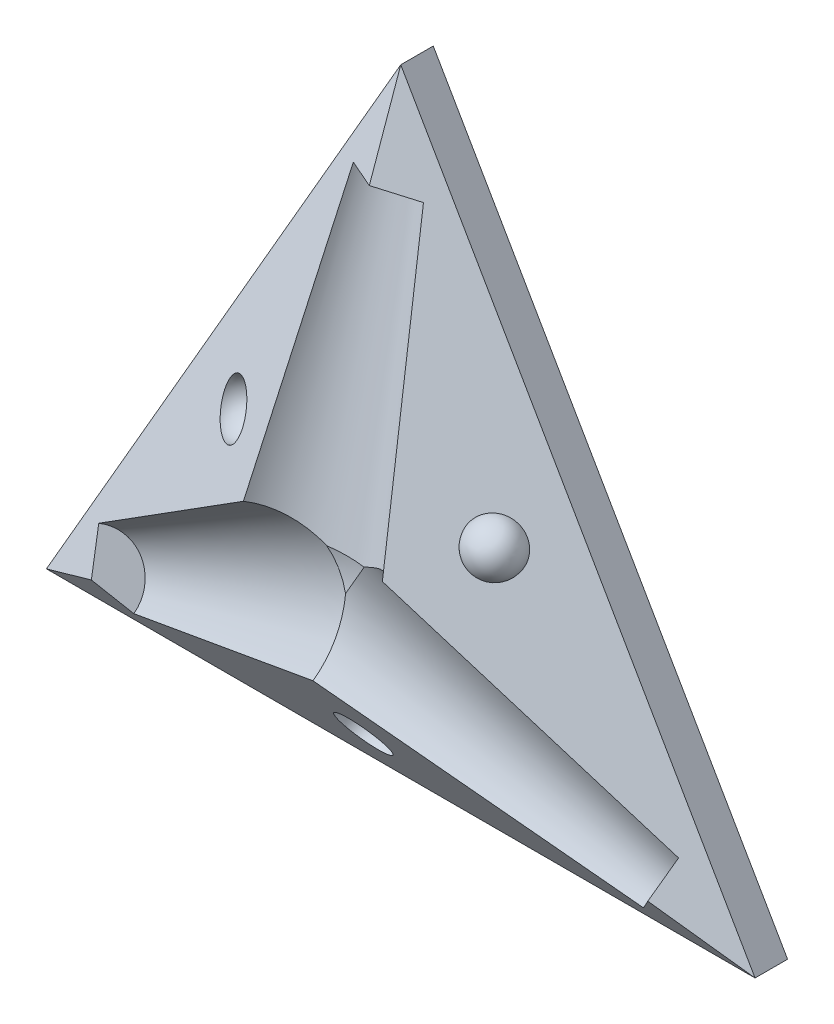
ISO-10303-21;
HEADER;
FILE_DESCRIPTION(('STEP AP214'),'2;1');
FILE_NAME('part.step','',(''),(''),'','','');
FILE_SCHEMA(('AUTOMOTIVE_DESIGN { 1 0 10303 214 1 1 1 1 }'));
ENDSEC;
DATA;
#1=APPLICATION_CONTEXT('core data for automotive mechanical design processes');
#2=APPLICATION_PROTOCOL_DEFINITION('international standard','automotive_design',2000,#1);
#3=PRODUCT_CONTEXT('',#1,'mechanical');
#4=PRODUCT('Part','Part','',(#3));
#5=PRODUCT_RELATED_PRODUCT_CATEGORY('part','',(#4));
#6=PRODUCT_DEFINITION_FORMATION('','',#4);
#7=PRODUCT_DEFINITION_CONTEXT('part definition',#1,'design');
#8=PRODUCT_DEFINITION('design','',#6,#7);
#9=PRODUCT_DEFINITION_SHAPE('','',#8);
#10=(LENGTH_UNIT() NAMED_UNIT(*) SI_UNIT(.MILLI.,.METRE.));
#11=(NAMED_UNIT(*) PLANE_ANGLE_UNIT() SI_UNIT($,.RADIAN.));
#12=(NAMED_UNIT(*) SI_UNIT($,.STERADIAN.) SOLID_ANGLE_UNIT());
#13=UNCERTAINTY_MEASURE_WITH_UNIT(LENGTH_MEASURE(1.E-05),#10,'distance_accuracy_value','');
#14=(GEOMETRIC_REPRESENTATION_CONTEXT(3) GLOBAL_UNCERTAINTY_ASSIGNED_CONTEXT((#13)) GLOBAL_UNIT_ASSIGNED_CONTEXT((#10,
#11,#12)) REPRESENTATION_CONTEXT('',''));
#15=CARTESIAN_POINT('',(0.,0.,0.));
#16=DIRECTION('',(0.,0.,1.));
#17=DIRECTION('',(1.,0.,0.));
#18=AXIS2_PLACEMENT_3D('',#15,#16,#17);
#19=CARTESIAN_POINT('',(14.2886901662352,8.24957911384317,23.3333333333334));
#20=DIRECTION('',(-0.5,-0.288675134594816,-0.816496580927725));
#21=DIRECTION('',(-0.852802865422442,0.,0.522232967867094));
#22=AXIS2_PLACEMENT_3D('',#19,#20,#21);
#23=PLANE('',#22);
#24=DIRECTION('',(0.120527440954869,-0.956829205626237,0.264482527282114));
#25=VECTOR('',#24,1.);
#26=CARTESIAN_POINT('',(0.,116.93400174157,-6.34241279137218));
#27=LINE('',#26,#25);
#28=CARTESIAN_POINT('',(13.7270239831756,7.95950307655349,23.7798395884152));
#29=VERTEX_POINT('',#28);
#30=CARTESIAN_POINT('',(6.92820323027557,61.9331891405294,8.86067030199187));
#31=VERTEX_POINT('',#30);
#32=EDGE_CURVE('E154',#29,#31,#27,.F.);
#33=ORIENTED_EDGE('',*,*,#32,.F.);
#34=DIRECTION('',(0.768374678677774,-0.582794428533163,-0.264482527282111));
#35=VECTOR('',#34,1.);
#36=CARTESIAN_POINT('',(101.427025906879,-58.5589207104388,-6.4074099333175));
#37=LINE('',#36,#35);
#38=CARTESIAN_POINT('',(57.2590265807308,-25.0585144099201,8.79567316004556));
#39=VERTEX_POINT('',#38);
#40=EDGE_CURVE('E62',#29,#39,#37,.T.);
#41=ORIENTED_EDGE('',*,*,#40,.T.);
#42=DIRECTION('',(-0.288675134594806,-0.833333333333336,0.471404520791032));
#43=VECTOR('',#42,1.);
#44=CARTESIAN_POINT('',(59.7125222260506,-17.9758825535151,4.78913154859609));
#45=LINE('',#44,#43);
#46=CARTESIAN_POINT('',(54.9496255039723,-31.7251810765868,12.5669093263738));
#47=VERTEX_POINT('',#46);
#48=EDGE_CURVE('E148',#39,#47,#45,.T.);
#49=ORIENTED_EDGE('',*,*,#48,.T.);
#50=DIRECTION('',(-0.816496580927729,0.471404520791026,0.333333333333336));
#51=VECTOR('',#50,1.);
#52=CARTESIAN_POINT('',(9.525793444157,-5.49971940922852,31.1111111111111));
#53=LINE('',#52,#51);
#54=CARTESIAN_POINT('',(70.0000000000006,-40.4145188432733,6.42261966752936));
#55=VERTEX_POINT('',#54);
#56=EDGE_CURVE('E190',#55,#47,#53,.T.);
#57=ORIENTED_EDGE('',*,*,#56,.F.);
#58=DIRECTION('',(0.500000000000004,-0.866025403784436,0.));
#59=VECTOR('',#58,1.);
#60=CARTESIAN_POINT('',(70.0000000000006,-40.4145188432733,6.42261966752934));
#61=LINE('',#60,#59);
#62=CARTESIAN_POINT('',(0.,80.8290376865478,6.42261966752933));
#63=VERTEX_POINT('',#62);
#64=EDGE_CURVE('E163',#63,#55,#61,.T.);
#65=ORIENTED_EDGE('',*,*,#64,.F.);
#66=DIRECTION('',(0.,0.942809041582063,-0.333333333333335));
#67=VECTOR('',#66,1.);
#68=CARTESIAN_POINT('',(1.70002900645727E-13,10.9994388184575,31.1111111111111));
#69=LINE('',#68,#67);
#70=CARTESIAN_POINT('',(0.,63.2665224738628,12.6319064683202));
#71=VERTEX_POINT('',#70);
#72=EDGE_CURVE('E161',#71,#63,#69,.T.);
#73=ORIENTED_EDGE('',*,*,#72,.F.);
#74=DIRECTION('',(-0.866025403784439,0.166666666666666,0.471404520791032));
#75=VECTOR('',#74,1.);
#76=CARTESIAN_POINT('',(14.2886901662351,60.5166627692485,4.85412869054242));
#77=LINE('',#76,#75);
#78=EDGE_CURVE('E194',#31,#71,#77,.T.);
#79=ORIENTED_EDGE('',*,*,#78,.F.);
#80=EDGE_LOOP('',(#33,#41,#49,#57,#65,#73,#79));
#81=FACE_BOUND('',#80,.T.);
#82=CARTESIAN_POINT('',(25.9572871763582,14.9864467387034,13.8059637703443));
#83=DIRECTION('',(-0.5,-0.288675134594816,-0.816496580927725));
#84=DIRECTION('',(-0.852802865422442,0.,0.522232967867094));
#85=AXIS2_PLACEMENT_3D('',#82,#83,#84);
#86=CIRCLE('',#85,5.);
#87=CARTESIAN_POINT('',(21.693272849246,14.9864467387034,16.4171286096798));
#88=VERTEX_POINT('',#87);
#89=EDGE_CURVE('E11',#88,#88,#86,.F.);
#90=ORIENTED_EDGE('',*,*,#89,.F.);
#91=EDGE_LOOP('',(#90));
#92=FACE_BOUND('',#91,.T.);
#93=ADVANCED_FACE('F37',(#81,#92),#23,.F.);
#94=CARTESIAN_POINT('',(-14.2886901662352,8.24957911384304,23.3333333333332));
#95=DIRECTION('',(0.500000000000001,-0.288675134594813,-0.816496580927725));
#96=DIRECTION('',(-0.852802865422441,0.,-0.522232967867095));
#97=AXIS2_PLACEMENT_3D('',#94,#95,#96);
#98=PLANE('',#97);
#99=CARTESIAN_POINT('',(-24.3629279022203,14.0880181497125,15.0999479162657));
#100=DIRECTION('',(0.500000000000001,-0.288675134594813,-0.816496580927725));
#101=DIRECTION('',(-0.852802865422441,0.,-0.522232967867095));
#102=AXIS2_PLACEMENT_3D('',#99,#100,#101);
#103=CIRCLE('',#102,5.1);
#104=CARTESIAN_POINT('',(-28.7122225158747,14.0880181497125,12.4365597801436));
#105=VERTEX_POINT('',#104);
#106=EDGE_CURVE('E135',#105,#105,#103,.T.);
#107=ORIENTED_EDGE('',*,*,#106,.T.);
#108=EDGE_LOOP('',(#107));
#109=FACE_BOUND('',#108,.T.);
#110=DIRECTION('',(0.288675134594813,-0.833333333333332,0.471404520791033));
#111=VECTOR('',#110,1.);
#112=CARTESIAN_POINT('',(-59.7588310741075,-18.0026189794074,4.77022604054335));
#113=LINE('',#112,#111);
#114=CARTESIAN_POINT('',(-57.3053354287878,-25.0852508358118,8.7767676519925));
#115=VERTEX_POINT('',#114);
#116=CARTESIAN_POINT('',(-54.9959343520291,-31.7519175024791,12.5480038183212));
#117=VERTEX_POINT('',#116);
#118=EDGE_CURVE('E143',#115,#117,#113,.T.);
#119=ORIENTED_EDGE('',*,*,#118,.F.);
#120=DIRECTION('',(0.768374678677778,0.582794428533153,0.264482527282119));
#121=VECTOR('',#120,1.);
#122=CARTESIAN_POINT('',(-101.473334754948,-58.5856571363385,-6.42631544137495));
#123=LINE('',#122,#121);
#124=CARTESIAN_POINT('',(-13.7258558044406,7.96877687778813,23.7772761650021));
#125=VERTEX_POINT('',#124);
#126=EDGE_CURVE('E230',#125,#115,#123,.F.);
#127=ORIENTED_EDGE('',*,*,#126,.F.);
#128=DIRECTION('',(0.120527440954865,0.956829205626238,-0.264482527282114));
#129=VECTOR('',#128,1.);
#130=CARTESIAN_POINT('',(0.,116.93400174157,-6.34241279137217));
#131=LINE('',#130,#129);
#132=CARTESIAN_POINT('',(-6.92820323027546,61.9331891405294,8.86067030199187));
#133=VERTEX_POINT('',#132);
#134=EDGE_CURVE('E156',#133,#125,#131,.F.);
#135=ORIENTED_EDGE('',*,*,#134,.F.);
#136=DIRECTION('',(-0.866025403784438,-0.16666666666667,-0.471404520791032));
#137=VECTOR('',#136,1.);
#138=CARTESIAN_POINT('',(-14.2886901662353,60.5166627692484,4.85412869054226));
#139=LINE('',#138,#137);
#140=EDGE_CURVE('E159',#71,#133,#139,.T.);
#141=ORIENTED_EDGE('',*,*,#140,.F.);
#142=ORIENTED_EDGE('',*,*,#72,.T.);
#143=DIRECTION('',(0.499999999999998,0.86602540378444,0.));
#144=VECTOR('',#143,1.);
#145=CARTESIAN_POINT('',(0.,80.8290376865478,6.42261966752933));
#146=LINE('',#145,#144);
#147=CARTESIAN_POINT('',(-70.,-40.414518843274,6.42261966752947));
#148=VERTEX_POINT('',#147);
#149=EDGE_CURVE('E169',#148,#63,#146,.T.);
#150=ORIENTED_EDGE('',*,*,#149,.F.);
#151=DIRECTION('',(0.816496580927725,0.471404520791033,0.333333333333333));
#152=VECTOR('',#151,1.);
#153=CARTESIAN_POINT('',(-9.52579344415676,-5.49971940922873,31.111111111111));
#154=LINE('',#153,#152);
#155=EDGE_CURVE('E187',#148,#117,#154,.T.);
#156=ORIENTED_EDGE('',*,*,#155,.T.);
#157=EDGE_LOOP('',(#119,#127,#135,#141,#142,#150,#156));
#158=FACE_BOUND('',#157,.T.);
#159=ADVANCED_FACE('F242',(#109,#158),#98,.F.);
#160=CARTESIAN_POINT('',(0.,0.,35.));
#161=DIRECTION('',(-1.,0.,0.));
#162=DIRECTION('',(0.,1.,0.));
#163=AXIS2_PLACEMENT_3D('',#160,#161,#162);
#164=SPHERICAL_SURFACE('',#163,18.1462929989925);
#165=CARTESIAN_POINT('',(0.,7.4913445405629,32.3514097375816));
#166=DIRECTION('',(0.,-0.942809041582063,0.333333333333335));
#167=DIRECTION('',(0.,-0.333333333333335,-0.942809041582063));
#168=AXIS2_PLACEMENT_3D('',#165,#166,#167);
#169=CIRCLE('',#168,16.3141863481352);
#170=CARTESIAN_POINT('',(3.70475484468206,2.19535583062093,17.3720916180324));
#171=VERTEX_POINT('',#170);
#172=CARTESIAN_POINT('',(-3.6715596232634,2.19278785936838,17.3648282984851));
#173=VERTEX_POINT('',#172);
#174=EDGE_CURVE('E133',#171,#173,#169,.F.);
#175=ORIENTED_EDGE('',*,*,#174,.T.);
#176=CARTESIAN_POINT('',(-6.40338777437427,-3.69699765526059,32.3858278879344));
#177=DIRECTION('',(0.816496580927725,0.471404520791033,0.333333333333334));
#178=DIRECTION('',(-0.500000000000001,0.866025403784438,0.));
#179=AXIS2_PLACEMENT_3D('',#176,#177,#178);
#180=CIRCLE('',#179,16.3640730602675);
#181=CARTESIAN_POINT('',(0.014373682368412,-4.17409906182547,17.3403103078054));
#182=VERTEX_POINT('',#181);
#183=EDGE_CURVE('E122',#182,#173,#180,.T.);
#184=ORIENTED_EDGE('',*,*,#183,.F.);
#185=CARTESIAN_POINT('',(6.42255268419878,-3.70806252110646,32.3780038462618));
#186=DIRECTION('',(0.816496580927729,-0.471404520791026,-0.333333333333335));
#187=DIRECTION('',(0.499999999999994,0.866025403784442,0.));
#188=AXIS2_PLACEMENT_3D('',#185,#186,#187);
#189=CIRCLE('',#188,16.3528032805791);
#190=EDGE_CURVE('E131',#182,#171,#189,.T.);
#191=ORIENTED_EDGE('',*,*,#190,.T.);
#192=EDGE_LOOP('',(#175,#184,#191));
#193=FACE_BOUND('',#192,.T.);
#194=ADVANCED_FACE('F130',(#193),#164,.F.);
#195=CARTESIAN_POINT('',(1.07847916210895E-13,-16.4991582276861,23.3333333333332));
#196=DIRECTION('',(0.,0.577350269189629,-0.816496580927724));
#197=DIRECTION('',(0.,0.816496580927724,0.577350269189629));
#198=AXIS2_PLACEMENT_3D('',#195,#196,#197);
#199=PLANE('',#198);
#200=CARTESIAN_POINT('',(1.0280160862097E-13,-29.9728934774056,13.8059637703442));
#201=DIRECTION('',(0.,0.577350269189629,-0.816496580927724));
#202=DIRECTION('',(0.,0.816496580927724,0.577350269189629));
#203=AXIS2_PLACEMENT_3D('',#200,#201,#202);
#204=CIRCLE('',#203,5.1);
#205=CARTESIAN_POINT('',(1.0280160862097E-13,-25.8087609146742,16.7504501432114));
#206=VERTEX_POINT('',#205);
#207=EDGE_CURVE('E41',#206,#206,#204,.T.);
#208=ORIENTED_EDGE('',*,*,#207,.T.);
#209=EDGE_LOOP('',(#208));
#210=FACE_BOUND('',#209,.T.);
#211=DIRECTION('',(0.577350269189627,-0.666666666666663,-0.471404520791036));
#212=VECTOR('',#211,1.);
#213=CARTESIAN_POINT('',(-45.4701409078722,-42.7513563209365,4.77022604054331));
#214=LINE('',#213,#212);
#215=CARTESIAN_POINT('',(-50.3771321985116,-37.085250835813,8.77676765199251));
#216=VERTEX_POINT('',#215);
#217=EDGE_CURVE('E46',#117,#216,#214,.T.);
#218=ORIENTED_EDGE('',*,*,#217,.F.);
#219=ORIENTED_EDGE('',*,*,#155,.F.);
#220=DIRECTION('',(-1.,0.,0.));
#221=VECTOR('',#220,1.);
#222=CARTESIAN_POINT('',(-70.,-40.4145188432742,6.4226196675293));
#223=LINE('',#222,#221);
#224=EDGE_CURVE('E166',#55,#148,#223,.T.);
#225=ORIENTED_EDGE('',*,*,#224,.F.);
#226=ORIENTED_EDGE('',*,*,#56,.T.);
#227=DIRECTION('',(-0.577350269189622,-0.666666666666668,-0.471404520791034));
#228=VECTOR('',#227,1.);
#229=CARTESIAN_POINT('',(45.4238320598154,-42.7246198950444,4.78913154859589));
#230=LINE('',#229,#228);
#231=CARTESIAN_POINT('',(50.3308233504554,-37.0585144099202,8.79567316004554));
#232=VERTEX_POINT('',#231);
#233=EDGE_CURVE('E126',#47,#232,#230,.T.);
#234=ORIENTED_EDGE('',*,*,#233,.T.);
#235=DIRECTION('',(-0.888902119632646,0.374034777093064,0.26448252728211));
#236=VECTOR('',#235,1.);
#237=CARTESIAN_POINT('',(101.427025906879,-58.5589207104388,-6.4074099333175));
#238=LINE('',#237,#236);
#239=CARTESIAN_POINT('',(0.00861543682646737,-15.8837917896348,23.7684631145938));
#240=VERTEX_POINT('',#239);
#241=EDGE_CURVE('E141',#232,#240,#238,.T.);
#242=ORIENTED_EDGE('',*,*,#241,.T.);
#243=DIRECTION('',(-0.888902119632633,-0.374034777093087,-0.264482527282119));
#244=VECTOR('',#243,1.);
#245=CARTESIAN_POINT('',(-101.473334754948,-58.5856571363385,-6.42631544137492));
#246=LINE('',#245,#244);
#247=EDGE_CURVE('E54',#216,#240,#246,.F.);
#248=ORIENTED_EDGE('',*,*,#247,.F.);
#249=EDGE_LOOP('',(#218,#219,#225,#226,#234,#242,#248));
#250=FACE_BOUND('',#249,.T.);
#251=ADVANCED_FACE('F239',(#210,#250),#199,.F.);
#252=CARTESIAN_POINT('',(0.,63.2665224738628,12.6319064683201));
#253=DIRECTION('',(0.,-0.942809041582063,0.333333333333335));
#254=DIRECTION('',(0.,-0.333333333333335,-0.942809041582063));
#255=AXIS2_PLACEMENT_3D('',#252,#253,#254);
#256=CONICAL_SURFACE('',#255,8.,0.139626340159539);
#257=ORIENTED_EDGE('',*,*,#134,.T.);
#258=CARTESIAN_POINT('',(-15.0757914335528,8.74933439696247,26.6181679804811));
#259=CARTESIAN_POINT('',(-15.0091707894226,8.71072231870982,26.4305657436891));
#260=CARTESIAN_POINT('',(-14.9391674407828,8.67017199110773,26.2445877853769));
#261=CARTESIAN_POINT('',(-14.7924543855662,8.58522813173056,25.8761880497999));
#262=CARTESIAN_POINT('',(-14.7157446414114,8.54083457842074,25.6937662924685));
#263=CARTESIAN_POINT('',(-14.4756824589843,8.40196104379764,25.1523830821956));
#264=CARTESIAN_POINT('',(-14.3023663086696,8.30177035952758,24.7992169378157));
#265=CARTESIAN_POINT('',(-13.9308001478429,8.08710196751161,24.1122387129287));
#266=CARTESIAN_POINT('',(-13.7326217188934,7.97266528276143,23.778374936331));
#267=CARTESIAN_POINT('',(-13.3123454865876,7.7300892949484,23.1313324942129));
#268=CARTESIAN_POINT('',(-13.0902489129175,7.6019506963344,22.8181527666129));
#269=CARTESIAN_POINT('',(-12.6237392601552,7.33289869876248,22.2144251349722));
#270=CARTESIAN_POINT('',(-12.379312966545,7.19197773567696,21.9238908232055));
#271=CARTESIAN_POINT('',(-11.8702538199921,6.89858456914729,21.3673884024329));
#272=CARTESIAN_POINT('',(-11.6056199582142,6.74611178899748,21.1014215213889));
#273=CARTESIAN_POINT('',(-11.0583751104035,6.43091091009429,20.5954213216938));
#274=CARTESIAN_POINT('',(-10.7757660764328,6.26818392494168,20.3553851946363));
#275=CARTESIAN_POINT('',(-10.1948220906785,5.93378744961524,19.902109520577));
#276=CARTESIAN_POINT('',(-9.89648706587387,5.76211791791831,19.6888700980166));
#277=CARTESIAN_POINT('',(-9.27770717219765,5.40618764820704,19.2840159497889));
#278=CARTESIAN_POINT('',(-8.95687512567538,5.22170784596626,19.0931865938544));
#279=CARTESIAN_POINT('',(-8.30338633685531,4.84611395296003,18.7405334906911));
#280=CARTESIAN_POINT('',(-7.97072900229919,4.65499952991715,18.5787111987131));
#281=CARTESIAN_POINT('',(-7.29552006166699,4.26729195807125,18.2837382973585));
#282=CARTESIAN_POINT('',(-6.95295816816744,4.07069312089012,18.1506188093257));
#283=CARTESIAN_POINT('',(-6.26029014522348,3.67343014493929,17.9127894220697));
#284=CARTESIAN_POINT('',(-5.91018188367924,3.47276485824645,17.8080876684471));
#285=CARTESIAN_POINT('',(-5.25711431144884,3.09878127751295,17.6400508510026));
#286=CARTESIAN_POINT('',(-4.95491178362537,2.92584848567273,17.5728749987751));
#287=CARTESIAN_POINT('',(-4.34756357936679,2.57862854174079,17.4581788836247));
#288=CARTESIAN_POINT('',(-4.04241784053151,2.40434136094944,17.4106590383781));
#289=CARTESIAN_POINT('',(-3.43145994600845,2.0558188056234,17.3349190010477));
#290=CARTESIAN_POINT('',(-3.12565605144939,1.88158632267475,17.3066181250681));
#291=CARTESIAN_POINT('',(-2.51297252118873,1.53311395761892,17.2684494486917));
#292=CARTESIAN_POINT('',(-2.20609309246336,1.35887408269313,17.258578277936));
#293=CARTESIAN_POINT('',(-1.89905343935477,1.18493484071131,17.2576444902358));
#294=B_SPLINE_CURVE_WITH_KNOTS('',3,(#258,#259,#260,#261,#262,#263,#264,#265,#266,#267,#268,
#269,#270,#271,#272,#273,#274,#275,#276,#277,#278,#279,#280,#281,#282,#283,#284,#285,#286,#287,
#288,#289,#290,#291,#292,#293),.UNSPECIFIED.,.F.,.F.,(4,2,2,2,2,2,2,2,2,2,2,2,2,2,2,2,2,4),(0.,
0.608280065497964,1.21656353959398,2.43285012126538,3.64571194786538,4.85851144823196,
6.07203337964071,7.28561593412707,8.49906692062374,9.71252354206224,10.9604149179596,
12.2083688816127,13.4576692240999,14.7073272861759,15.770584939833,16.833865185801,
17.8926535723391,18.9512483124597),.UNSPECIFIED.);
#295=EDGE_CURVE('E224',#125,#173,#294,.T.);
#296=ORIENTED_EDGE('',*,*,#295,.T.);
#297=ORIENTED_EDGE('',*,*,#174,.F.);
#298=CARTESIAN_POINT('',(15.0760855818003,8.7392907556903,26.6181679804811));
#299=CARTESIAN_POINT('',(15.0094413714069,8.70069863812645,26.4306160361002));
#300=CARTESIAN_POINT('',(14.9394166379215,8.66016620478081,26.2446886679185));
#301=CARTESIAN_POINT('',(14.7926651706391,8.57525417854036,25.8763906430215));
#302=CARTESIAN_POINT('',(14.7159383994532,8.53087456418315,25.6940200061554));
#303=CARTESIAN_POINT('',(14.4758317094365,8.39203719546334,25.1527909129285));
#304=CARTESIAN_POINT('',(14.3024946057137,8.29186307567129,24.7997284439808));
#305=CARTESIAN_POINT('',(13.9309053540529,8.07721421775378,24.1129604041013));
#306=CARTESIAN_POINT('',(13.7327248963786,7.96278063350266,23.7792030199447));
#307=CARTESIAN_POINT('',(13.312462744696,7.72019715808202,23.1323731304067));
#308=CARTESIAN_POINT('',(13.0903822781828,7.59204797134228,22.8192995640442));
#309=CARTESIAN_POINT('',(12.6239238547989,7.32296107792996,22.2157836309534));
#310=CARTESIAN_POINT('',(12.3795327365816,7.18201582296232,21.9253548123965));
#311=CARTESIAN_POINT('',(11.8705631283472,6.88855924471619,21.3690609462836));
#312=CARTESIAN_POINT('',(11.605983629672,6.73604734354363,21.1031971275209));
#313=CARTESIAN_POINT('',(11.0588655043258,6.42075073930197,20.5973979640525));
#314=CARTESIAN_POINT('',(10.7763287136813,6.25796708647067,20.3574599753363));
#315=CARTESIAN_POINT('',(10.1955500781096,5.9234385137212,19.9043765970883));
#316=CARTESIAN_POINT('',(9.89730816238679,5.7516935534072,19.6912313283478));
#317=CARTESIAN_POINT('',(9.27872740204501,5.3955807347899,19.2865560806318));
#318=CARTESIAN_POINT('',(8.95800149002347,5.21099287286261,19.0958123132553));
#319=CARTESIAN_POINT('',(8.30475367925772,4.83515614979248,18.7433270193094));
#320=CARTESIAN_POINT('',(7.97223118186189,4.64390695060992,18.581586967146));
#321=CARTESIAN_POINT('',(7.29730921473178,4.25588694993242,18.286774687602));
#322=CARTESIAN_POINT('',(6.95489963513102,4.05911050267429,18.1537330738087));
#323=CARTESIAN_POINT('',(6.26263259431495,3.66148363344551,17.9160622175492));
#324=CARTESIAN_POINT('',(5.91277305619495,3.46063207616924,17.8114410129988));
#325=CARTESIAN_POINT('',(4.96544658098059,2.91713746328065,17.5677518278036));
#326=CARTESIAN_POINT('',(4.36275338626149,2.57173957623491,17.4542829467231));
#327=CARTESIAN_POINT('',(3.45473191460492,2.05233724403957,17.3407310703759));
#328=CARTESIAN_POINT('',(3.15197869230984,1.87931849665695,17.3123229229921));
#329=CARTESIAN_POINT('',(2.54545160898588,1.53315510749818,17.2736247104118));
#330=CARTESIAN_POINT('',(2.24167793325261,1.3600104926246,17.2633315170441));
#331=CARTESIAN_POINT('',(1.93768092704914,1.18703522844209,17.2618039322121));
#332=B_SPLINE_CURVE_WITH_KNOTS('',3,(#298,#299,#300,#301,#302,#303,#304,#305,#306,#307,#308,
#309,#310,#311,#312,#313,#314,#315,#316,#317,#318,#319,#320,#321,#322,#323,#324,#325,#326,#327,
#328,#329,#330,#331),.UNSPECIFIED.,.F.,.F.,(4,2,2,2,2,2,2,2,2,2,2,2,2,2,2,2,4),(0.,
0.608152333941031,1.2163080608218,2.43233888359554,3.64493808584423,4.857475039173,
6.07073196404311,7.28404954577284,8.49724327193083,9.71044246740396,10.9581117340848,
12.2058444081568,13.4549015696164,14.7043116249441,16.8107627773091,17.8599729805197,
18.9090019836361),.UNSPECIFIED.);
#333=EDGE_CURVE('E138',#29,#171,#332,.T.);
#334=ORIENTED_EDGE('',*,*,#333,.F.);
#335=ORIENTED_EDGE('',*,*,#32,.T.);
#336=CARTESIAN_POINT('',(0.,63.2665224738628,12.6319064683201));
#337=DIRECTION('',(0.,-0.942809041582063,0.333333333333335));
#338=DIRECTION('',(0.,-0.333333333333335,-0.942809041582063));
#339=AXIS2_PLACEMENT_3D('',#336,#337,#338);
#340=CIRCLE('',#339,8.);
#341=EDGE_CURVE('E151',#133,#31,#340,.T.);
#342=ORIENTED_EDGE('',*,*,#341,.F.);
#343=EDGE_LOOP('',(#257,#296,#297,#334,#335,#342));
#344=FACE_BOUND('',#343,.T.);
#345=ADVANCED_FACE('F202',(#344),#256,.F.);
#346=CARTESIAN_POINT('',(54.9496255039723,-31.7251810765868,12.5669093263738));
#347=DIRECTION('',(-0.816496580927729,0.471404520791026,0.333333333333335));
#348=DIRECTION('',(-0.499999999999994,-0.866025403784442,0.));
#349=AXIS2_PLACEMENT_3D('',#346,#347,#348);
#350=CONICAL_SURFACE('',#349,8.00000000000001,0.139626340159547);
#351=CARTESIAN_POINT('',(0.00884756373772505,-17.4535105576248,26.6338965980377));
#352=CARTESIAN_POINT('',(0.00881832826266131,-17.3767510663402,26.4460028629091));
#353=CARTESIAN_POINT('',(0.00879197680269703,-17.2960879609571,26.259727933354));
#354=CARTESIAN_POINT('',(0.00874488433845864,-17.1270212532928,25.8907237250036));
#355=CARTESIAN_POINT('',(0.00872414336769501,-17.0386176047827,25.7079944673921));
#356=CARTESIAN_POINT('',(0.00867010852542587,-16.7619395294869,25.1656732088489));
#357=CARTESIAN_POINT('',(0.00864498951173653,-16.5621628421345,24.8118615983982));
#358=CARTESIAN_POINT('',(0.0086159486966805,-16.1338572624897,24.1236289877345));
#359=CARTESIAN_POINT('',(0.00861196326876718,-15.9054167962353,23.7891527859231));
#360=CARTESIAN_POINT('',(0.00862491117648305,-15.4209177028181,23.1408519867925));
#361=CARTESIAN_POINT('',(0.00864184342952565,-15.1648605055746,22.827026321598));
#362=CARTESIAN_POINT('',(0.00869708412074475,-14.6269712283757,22.2219776796231));
#363=CARTESIAN_POINT('',(0.00873540551068924,-14.3451236180838,21.9307685196441));
#364=CARTESIAN_POINT('',(0.00883446241036182,-13.7580907366592,21.3729004042641));
#365=CARTESIAN_POINT('',(0.0088951990316514,-13.4529043087598,21.1062426671771));
#366=CARTESIAN_POINT('',(0.0090407955813447,-12.821702746588,20.5987995549272));
#367=CARTESIAN_POINT('',(0.00912565806525501,-12.4956854086609,20.3580169242828));
#368=CARTESIAN_POINT('',(0.00932203621398835,-11.8254863037085,19.9032601730339));
#369=CARTESIAN_POINT('',(0.00943355220813747,-11.4813043122848,19.6892863837245));
#370=CARTESIAN_POINT('',(0.00969040182123978,-10.7675048262964,19.2830088213659));
#371=CARTESIAN_POINT('',(0.00983659929618451,-10.3974440032258,19.091484932378));
#372=CARTESIAN_POINT('',(0.010166460938617,-9.64371616292905,18.737466771142));
#373=CARTESIAN_POINT('',(0.0103501258246635,-9.26004888487176,18.5749730557536));
#374=CARTESIAN_POINT('',(0.0107627407827795,-8.48160178962432,18.2787757813829));
#375=CARTESIAN_POINT('',(0.0109917097846331,-8.08681738661758,18.1450843060149));
#376=CARTESIAN_POINT('',(0.0115059758218648,-7.28863093094159,17.9060944932931));
#377=CARTESIAN_POINT('',(0.0117912929862875,-6.88522584479654,17.8008063342432));
#378=CARTESIAN_POINT('',(0.0124763955744973,-6.01868820027187,17.6060214194052));
#379=CARTESIAN_POINT('',(0.0128863007705368,-5.55467840424203,17.520422974336));
#380=CARTESIAN_POINT('',(0.0138333061636433,-4.62146292146091,17.3836875005994));
#381=CARTESIAN_POINT('',(0.0143704600380672,-4.15225512187153,17.3325650500568));
#382=CARTESIAN_POINT('',(0.0156307744255285,-3.21171974051202,17.2635878606557));
#383=CARTESIAN_POINT('',(0.0163538198758042,-2.74039364660251,17.2457125986845));
#384=CARTESIAN_POINT('',(0.0180807671048889,-1.79759239297038,17.2418408938619));
#385=CARTESIAN_POINT('',(0.0190847069902655,-1.32611722169817,17.2558487781678));
#386=CARTESIAN_POINT('',(0.0219195814022566,-0.259751116557822,17.3222186937115));
#387=CARTESIAN_POINT('',(0.0238995416663875,0.334573874625178,17.3838002263246));
#388=CARTESIAN_POINT('',(0.0293821969803051,1.5161717024956,17.5532737778383));
#389=CARTESIAN_POINT('',(0.0328838920255198,2.10344891061768,17.6611353833053));
#390=CARTESIAN_POINT('',(0.0414902829384491,2.91668388380946,17.8423199434421));
#391=CARTESIAN_POINT('',(0.0443539281868768,3.14690691923166,17.8972306829364));
#392=CARTESIAN_POINT('',(0.0516877938193536,3.60546117707807,18.0137524913548));
#393=CARTESIAN_POINT('',(0.0561567497363472,3.83379374416981,18.0753582601917));
#394=CARTESIAN_POINT('',(0.0665094076984813,4.20869483800193,18.1823599748507));
#395=CARTESIAN_POINT('',(0.0713467455876011,4.3558453931001,18.2258603769024));
#396=CARTESIAN_POINT('',(0.0838548130755698,4.64955347731292,18.3156799805854));
#397=CARTESIAN_POINT('',(0.0915310079693024,4.79610930762956,18.3620044744662));
#398=CARTESIAN_POINT('',(0.111328807039115,5.05742607364475,18.4472777275028));
#399=CARTESIAN_POINT('',(0.122194943092667,5.17246464066077,18.4857584487233));
#400=CARTESIAN_POINT('',(0.153002977965952,5.40125133493062,18.5641839245334));
#401=CARTESIAN_POINT('',(0.172923105386935,5.51500189070448,18.6041249569811));
#402=CARTESIAN_POINT('',(0.220200237919282,5.66558382517066,18.6582834973572));
#403=CARTESIAN_POINT('',(0.235040705795915,5.70587936388139,18.6729108041026));
#404=CARTESIAN_POINT('',(0.271312483872899,5.78358121487995,18.7013857584667));
#405=CARTESIAN_POINT('',(0.292701019650386,5.8210043625193,18.7152377954733));
#406=CARTESIAN_POINT('',(0.336925393998782,5.88072246741231,18.7375768068584));
#407=CARTESIAN_POINT('',(0.357725803301356,5.90433926518818,18.7464881932962));
#408=CARTESIAN_POINT('',(0.403585150595686,5.94754192512494,18.7629391703208));
#409=CARTESIAN_POINT('',(0.428640826487924,5.96713084982307,18.7704798026319));
#410=CARTESIAN_POINT('',(0.489357199033134,6.00696849583107,18.7859902051209));
#411=CARTESIAN_POINT('',(0.526018006039048,6.02585146491916,18.7934835300398));
#412=CARTESIAN_POINT('',(0.602121765825126,6.05814312807073,18.8065520309733));
#413=CARTESIAN_POINT('',(0.641581550771793,6.07151470255213,18.8121141620035));
#414=CARTESIAN_POINT('',(0.750003780224146,6.10265435997805,18.8254228112182));
#415=CARTESIAN_POINT('',(0.820089772289625,6.11684099291696,18.8319311114304));
#416=CARTESIAN_POINT('',(0.961343205156556,6.13971865233923,18.8431782831987));
#417=CARTESIAN_POINT('',(1.03251340110091,6.14839183979972,18.8479113909854));
#418=CARTESIAN_POINT('',(1.24767874133149,6.16998032128319,18.8609118632968));
#419=CARTESIAN_POINT('',(1.39219669527548,6.17825237064828,18.8678841286801));
#420=CARTESIAN_POINT('',(1.71621457571256,6.19133781160344,18.8828175177791));
#421=CARTESIAN_POINT('',(1.89574631305546,6.19483612374709,18.8906116516245));
#422=CARTESIAN_POINT('',(2.2549983281193,6.1979693920999,18.9066493708262));
#423=CARTESIAN_POINT('',(2.4347186281188,6.19760081241682,18.9148933606794));
#424=CARTESIAN_POINT('',(2.78734667640075,6.19444166763202,18.9320341618981));
#425=CARTESIAN_POINT('',(2.96025735104597,6.19174237640574,18.9408949350885));
#426=CARTESIAN_POINT('',(3.3057752836557,6.18452821235233,18.9597036307835));
#427=CARTESIAN_POINT('',(3.47838265747678,6.18001550976602,18.9696502434585));
#428=CARTESIAN_POINT('',(3.65092990239571,6.17483411000317,18.9802395704961));
#429=B_SPLINE_CURVE_WITH_KNOTS('',3,(#351,#352,#353,#354,#355,#356,#357,#358,#359,#360,#361,
#362,#363,#364,#365,#366,#367,#368,#369,#370,#371,#372,#373,#374,#375,#376,#377,#378,#379,#380,
#381,#382,#383,#384,#385,#386,#387,#388,#389,#390,#391,#392,#393,#394,#395,#396,#397,#398,#399,
#400,#401,#402,#403,#404,#405,#406,#407,#408,#409,#410,#411,#412,#413,#414,#415,#416,#417,#418,
#419,#420,#421,#422,#423,#424,#425,#426,#427,#428),.UNSPECIFIED.,.F.,.F.,(4,2,2,2,2,2,2,2,2,2,2,
2,2,2,2,2,2,2,2,2,2,2,2,2,2,2,2,2,2,2,2,2,2,2,2,2,2,2,4),(0.,0.608814403920869,1.21763244410445,
2.43499037958595,3.64868114555571,4.86230910005572,6.07667274143325,7.29109661066461,
8.50564916442494,9.72021672575901,10.9689857269313,12.2177786795425,13.4670945315083,
14.7168574818216,16.130995070255,17.5457302504332,18.9595918404126,20.3736453300902,
22.1642233118382,23.9536263944513,24.6636529581002,25.3731214717862,25.833689932979,
26.2951497240687,26.6607032115688,27.0253822950534,27.1611553112233,27.2960596771061,
27.3936624943671,27.4911908240081,27.6161659889937,27.7419696323918,27.956768565156,
28.1722589996729,28.6066921460851,29.1458875024563,29.6855759428879,30.2050412449677,
30.7238867079855),.UNSPECIFIED.);
#430=EDGE_CURVE('E119',#240,#182,#429,.T.);
#431=ORIENTED_EDGE('',*,*,#430,.F.);
#432=ORIENTED_EDGE('',*,*,#241,.F.);
#433=CARTESIAN_POINT('',(54.9496255039723,-31.7251810765868,12.5669093263738));
#434=DIRECTION('',(0.816496580927729,-0.471404520791026,-0.333333333333335));
#435=DIRECTION('',(0.499999999999994,0.866025403784442,0.));
#436=AXIS2_PLACEMENT_3D('',#433,#434,#435);
#437=CIRCLE('',#436,8.00000000000001);
#438=EDGE_CURVE('E139',#232,#39,#437,.T.);
#439=ORIENTED_EDGE('',*,*,#438,.T.);
#440=ORIENTED_EDGE('',*,*,#40,.F.);
#441=ORIENTED_EDGE('',*,*,#333,.T.);
#442=ORIENTED_EDGE('',*,*,#190,.F.);
#443=EDGE_LOOP('',(#431,#432,#439,#440,#441,#442));
#444=FACE_BOUND('',#443,.T.);
#445=ADVANCED_FACE('F137',(#444),#350,.F.);
#446=CARTESIAN_POINT('',(70.0000000000006,-40.4145188432733,35.));
#447=DIRECTION('',(-0.866025403784436,-0.500000000000004,0.));
#448=DIRECTION('',(0.500000000000004,-0.866025403784436,0.));
#449=AXIS2_PLACEMENT_3D('',#446,#447,#448);
#450=PLANE('',#449);
#451=DIRECTION('',(0.,0.,-1.));
#452=VECTOR('',#451,1.);
#453=CARTESIAN_POINT('',(0.,80.8290376865478,35.));
#454=LINE('',#453,#452);
#455=CARTESIAN_POINT('',(0.,80.8290376865478,0.));
#456=VERTEX_POINT('',#455);
#457=EDGE_CURVE('E185',#63,#456,#454,.T.);
#458=ORIENTED_EDGE('',*,*,#457,.F.);
#459=ORIENTED_EDGE('',*,*,#64,.T.);
#460=DIRECTION('',(0.,0.,-1.));
#461=VECTOR('',#460,1.);
#462=CARTESIAN_POINT('',(70.0000000000006,-40.4145188432733,35.));
#463=LINE('',#462,#461);
#464=CARTESIAN_POINT('',(70.0000000000006,-40.4145188432733,0.));
#465=VERTEX_POINT('',#464);
#466=EDGE_CURVE('E181',#55,#465,#463,.T.);
#467=ORIENTED_EDGE('',*,*,#466,.T.);
#468=DIRECTION('',(-0.500000000000004,0.866025403784436,0.));
#469=VECTOR('',#468,1.);
#470=CARTESIAN_POINT('',(70.0000000000006,-40.4145188432733,0.));
#471=LINE('',#470,#469);
#472=EDGE_CURVE('E172',#465,#456,#471,.T.);
#473=ORIENTED_EDGE('',*,*,#472,.T.);
#474=EDGE_LOOP('',(#458,#459,#467,#473));
#475=FACE_BOUND('',#474,.T.);
#476=ADVANCED_FACE('F39',(#475),#450,.F.);
#477=CARTESIAN_POINT('',(0.,80.8290376865478,35.));
#478=DIRECTION('',(0.86602540378444,-0.499999999999998,0.));
#479=DIRECTION('',(0.499999999999998,0.86602540378444,0.));
#480=AXIS2_PLACEMENT_3D('',#477,#478,#479);
#481=PLANE('',#480);
#482=DIRECTION('',(0.,0.,-1.));
#483=VECTOR('',#482,1.);
#484=CARTESIAN_POINT('',(-70.,-40.4145188432742,35.));
#485=LINE('',#484,#483);
#486=CARTESIAN_POINT('',(-70.,-40.4145188432742,0.));
#487=VERTEX_POINT('',#486);
#488=EDGE_CURVE('E183',#148,#487,#485,.T.);
#489=ORIENTED_EDGE('',*,*,#488,.F.);
#490=ORIENTED_EDGE('',*,*,#149,.T.);
#491=ORIENTED_EDGE('',*,*,#457,.T.);
#492=DIRECTION('',(-0.499999999999998,-0.86602540378444,0.));
#493=VECTOR('',#492,1.);
#494=CARTESIAN_POINT('',(0.,80.8290376865478,0.));
#495=LINE('',#494,#493);
#496=EDGE_CURVE('E175',#456,#487,#495,.T.);
#497=ORIENTED_EDGE('',*,*,#496,.T.);
#498=EDGE_LOOP('',(#489,#490,#491,#497));
#499=FACE_BOUND('',#498,.T.);
#500=ADVANCED_FACE('F249',(#499),#481,.F.);
#501=CARTESIAN_POINT('',(-70.,-40.4145188432742,35.));
#502=DIRECTION('',(0.,1.,0.));
#503=DIRECTION('',(-1.,0.,0.));
#504=AXIS2_PLACEMENT_3D('',#501,#502,#503);
#505=PLANE('',#504);
#506=ORIENTED_EDGE('',*,*,#466,.F.);
#507=ORIENTED_EDGE('',*,*,#224,.T.);
#508=ORIENTED_EDGE('',*,*,#488,.T.);
#509=DIRECTION('',(1.,0.,0.));
#510=VECTOR('',#509,1.);
#511=CARTESIAN_POINT('',(-70.,-40.4145188432742,0.));
#512=LINE('',#511,#510);
#513=EDGE_CURVE('E178',#487,#465,#512,.T.);
#514=ORIENTED_EDGE('',*,*,#513,.T.);
#515=EDGE_LOOP('',(#506,#507,#508,#514));
#516=FACE_BOUND('',#515,.T.);
#517=ADVANCED_FACE('F254',(#516),#505,.F.);
#518=CARTESIAN_POINT('',(0.,0.,0.));
#519=DIRECTION('',(0.,0.,1.));
#520=DIRECTION('',(1.,0.,0.));
#521=AXIS2_PLACEMENT_3D('',#518,#519,#520);
#522=PLANE('',#521);
#523=ORIENTED_EDGE('',*,*,#472,.F.);
#524=ORIENTED_EDGE('',*,*,#513,.F.);
#525=ORIENTED_EDGE('',*,*,#496,.F.);
#526=EDGE_LOOP('',(#523,#524,#525));
#527=FACE_BOUND('',#526,.T.);
#528=ADVANCED_FACE('F262',(#527),#522,.F.);
#529=CARTESIAN_POINT('',(-14.2886901662353,60.5166627692484,4.85412869054227));
#530=DIRECTION('',(0.,-0.942809041582063,0.333333333333335));
#531=DIRECTION('',(0.,-0.333333333333335,-0.942809041582063));
#532=AXIS2_PLACEMENT_3D('',#529,#530,#531);
#533=PLANE('',#532);
#534=ORIENTED_EDGE('',*,*,#140,.T.);
#535=ORIENTED_EDGE('',*,*,#341,.T.);
#536=ORIENTED_EDGE('',*,*,#78,.T.);
#537=EDGE_LOOP('',(#534,#535,#536));
#538=FACE_BOUND('',#537,.T.);
#539=ADVANCED_FACE('F264',(#538),#533,.T.);
#540=CARTESIAN_POINT('',(54.9496255039723,-31.7251810765868,12.5669093263738));
#541=DIRECTION('',(0.816496580927729,-0.471404520791026,-0.333333333333335));
#542=DIRECTION('',(0.499999999999994,0.866025403784442,0.));
#543=AXIS2_PLACEMENT_3D('',#540,#541,#542);
#544=PLANE('',#543);
#545=ORIENTED_EDGE('',*,*,#438,.F.);
#546=ORIENTED_EDGE('',*,*,#233,.F.);
#547=ORIENTED_EDGE('',*,*,#48,.F.);
#548=EDGE_LOOP('',(#545,#546,#547));
#549=FACE_BOUND('',#548,.T.);
#550=ADVANCED_FACE('F208',(#549),#544,.F.);
#551=CARTESIAN_POINT('',(-45.4701409078722,-42.7513563209366,4.77022604054327));
#552=DIRECTION('',(0.816496580927725,0.471404520791033,0.333333333333334));
#553=DIRECTION('',(-0.500000000000001,0.866025403784438,0.));
#554=AXIS2_PLACEMENT_3D('',#551,#552,#553);
#555=PLANE('',#554);
#556=ORIENTED_EDGE('',*,*,#118,.T.);
#557=ORIENTED_EDGE('',*,*,#217,.T.);
#558=CARTESIAN_POINT('',(-54.9959343520291,-31.7519175024791,12.5480038183212));
#559=DIRECTION('',(0.816496580927725,0.471404520791033,0.333333333333334));
#560=DIRECTION('',(-0.500000000000001,0.866025403784438,0.));
#561=AXIS2_PLACEMENT_3D('',#558,#559,#560);
#562=CIRCLE('',#561,8.00000000000084);
#563=EDGE_CURVE('E134',#216,#115,#562,.T.);
#564=ORIENTED_EDGE('',*,*,#563,.T.);
#565=EDGE_LOOP('',(#556,#557,#564));
#566=FACE_BOUND('',#565,.T.);
#567=ADVANCED_FACE('F220',(#566),#555,.T.);
#568=CARTESIAN_POINT('',(-54.9959343520291,-31.7519175024791,12.5480038183212));
#569=DIRECTION('',(0.816496580927725,0.471404520791033,0.333333333333334));
#570=DIRECTION('',(-0.500000000000001,0.866025403784438,0.));
#571=AXIS2_PLACEMENT_3D('',#568,#569,#570);
#572=CONICAL_SURFACE('',#571,8.00000000000084,0.139626340159525);
#573=ORIENTED_EDGE('',*,*,#126,.T.);
#574=ORIENTED_EDGE('',*,*,#563,.F.);
#575=ORIENTED_EDGE('',*,*,#247,.T.);
#576=ORIENTED_EDGE('',*,*,#430,.T.);
#577=ORIENTED_EDGE('',*,*,#183,.T.);
#578=ORIENTED_EDGE('',*,*,#295,.F.);
#579=EDGE_LOOP('',(#573,#574,#575,#576,#577,#578));
#580=FACE_BOUND('',#579,.T.);
#581=ADVANCED_FACE('F121',(#580),#572,.F.);
#582=CARTESIAN_POINT('',(25.9572871763582,14.9864467387034,13.8059637703443));
#583=DIRECTION('',(0.707106781186559,0.408248290463842,-0.577350269189627));
#584=DIRECTION('',(-0.499999999999985,0.866025403784448,0.));
#585=AXIS2_PLACEMENT_3D('',#582,#583,#584);
#586=SPHERICAL_SURFACE('',#585,5.);
#587=CARTESIAN_POINT('',(25.9572871763582,14.9864467387034,13.8059637703443));
#588=DIRECTION('',(-0.5,-0.288675134594816,-0.816496580927725));
#589=DIRECTION('',(-0.852802865422442,0.,0.522232967867094));
#590=AXIS2_PLACEMENT_3D('',#587,#588,#589);
#591=SPHERICAL_SURFACE('',#590,5.);
#592=ORIENTED_EDGE('',*,*,#89,.T.);
#593=EDGE_LOOP('',(#592));
#594=FACE_BOUND('',#593,.T.);
#595=ADVANCED_FACE('F219',(#594),#591,.T.);
#596=CARTESIAN_POINT('',(-24.3629279022203,14.0880181497125,15.0999479162657));
#597=DIRECTION('',(-0.707742209895917,0.407146374572571,-0.577349802116581));
#598=DIRECTION('',(0.499100154609916,0.86654399561654,-0.000734390413848235));
#599=AXIS2_PLACEMENT_3D('',#596,#597,#598);
#600=SPHERICAL_SURFACE('',#599,5.1);
#601=CARTESIAN_POINT('',(-24.3629279022203,14.0880181497125,15.0999479162657));
#602=DIRECTION('',(0.500000000000001,-0.288675134594813,-0.816496580927725));
#603=DIRECTION('',(-0.852802865422441,0.,-0.522232967867095));
#604=AXIS2_PLACEMENT_3D('',#601,#602,#603);
#605=SPHERICAL_SURFACE('',#604,5.1);
#606=ORIENTED_EDGE('',*,*,#106,.F.);
#607=EDGE_LOOP('',(#606));
#608=FACE_BOUND('',#607,.T.);
#609=ADVANCED_FACE('F294',(#608),#605,.F.);
#610=CARTESIAN_POINT('',(1.0280160862097E-13,-29.9728934774056,13.8059637703443));
#611=DIRECTION('',(0.,-0.816496580927724,-0.577350269189629));
#612=DIRECTION('',(-1.,0.,0.));
#613=AXIS2_PLACEMENT_3D('',#610,#611,#612);
#614=SPHERICAL_SURFACE('',#613,5.1);
#615=CARTESIAN_POINT('',(1.0280160862097E-13,-29.9728934774056,13.8059637703443));
#616=DIRECTION('',(0.,0.577350269189629,-0.816496580927724));
#617=DIRECTION('',(0.,0.816496580927724,0.577350269189629));
#618=AXIS2_PLACEMENT_3D('',#615,#616,#617);
#619=SPHERICAL_SURFACE('',#618,5.1);
#620=ORIENTED_EDGE('',*,*,#207,.F.);
#621=EDGE_LOOP('',(#620));
#622=FACE_BOUND('',#621,.T.);
#623=ADVANCED_FACE('F296',(#622),#619,.F.);
#624=CLOSED_SHELL('',(#93,#159,#194,#251,#345,#445,#476,#500,#517,#528,#539,#550,#567,#581,#595,
#609,#623));
#625=MANIFOLD_SOLID_BREP('B2',#624);
#626=ADVANCED_BREP_SHAPE_REPRESENTATION('',(#18,#625),#14);
#627=SHAPE_DEFINITION_REPRESENTATION(#9,#626);
ENDSEC;
END-ISO-10303-21;
